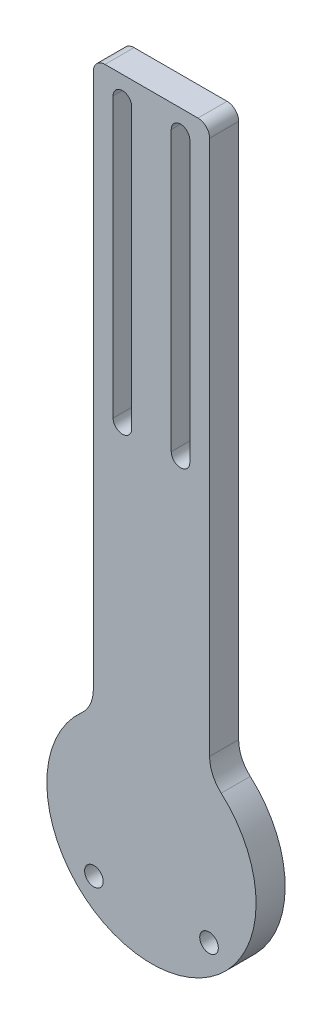
ISO-10303-21;
HEADER;
FILE_DESCRIPTION(('STEP AP214'),'2;1');
FILE_NAME('part.step','',(''),(''),'','','');
FILE_SCHEMA(('AUTOMOTIVE_DESIGN { 1 0 10303 214 1 1 1 1 }'));
ENDSEC;
DATA;
#1=APPLICATION_CONTEXT('core data for automotive mechanical design processes');
#2=APPLICATION_PROTOCOL_DEFINITION('international standard','automotive_design',2000,#1);
#3=PRODUCT_CONTEXT('',#1,'mechanical');
#4=PRODUCT('Part','Part','',(#3));
#5=PRODUCT_RELATED_PRODUCT_CATEGORY('part','',(#4));
#6=PRODUCT_DEFINITION_FORMATION('','',#4);
#7=PRODUCT_DEFINITION_CONTEXT('part definition',#1,'design');
#8=PRODUCT_DEFINITION('design','',#6,#7);
#9=PRODUCT_DEFINITION_SHAPE('','',#8);
#10=(LENGTH_UNIT() NAMED_UNIT(*) SI_UNIT(.MILLI.,.METRE.));
#11=(NAMED_UNIT(*) PLANE_ANGLE_UNIT() SI_UNIT($,.RADIAN.));
#12=(NAMED_UNIT(*) SI_UNIT($,.STERADIAN.) SOLID_ANGLE_UNIT());
#13=UNCERTAINTY_MEASURE_WITH_UNIT(LENGTH_MEASURE(1.E-05),#10,'distance_accuracy_value','');
#14=(GEOMETRIC_REPRESENTATION_CONTEXT(3) GLOBAL_UNCERTAINTY_ASSIGNED_CONTEXT((#13)) GLOBAL_UNIT_ASSIGNED_CONTEXT((#10,
#11,#12)) REPRESENTATION_CONTEXT('',''));
#15=CARTESIAN_POINT('',(0.,0.,0.));
#16=DIRECTION('',(0.,0.,1.));
#17=DIRECTION('',(1.,0.,0.));
#18=AXIS2_PLACEMENT_3D('',#15,#16,#17);
#19=CARTESIAN_POINT('',(16.,17.8885438199984,5.));
#20=DIRECTION('',(0.,0.,1.));
#21=DIRECTION('',(1.,0.,0.));
#22=AXIS2_PLACEMENT_3D('',#19,#20,#21);
#23=PLANE('',#22);
#24=CARTESIAN_POINT('',(-9.8994949366116,-9.89949493661173,5.));
#25=DIRECTION('',(0.,0.,1.));
#26=DIRECTION('',(1.,0.,0.));
#27=AXIS2_PLACEMENT_3D('',#24,#25,#26);
#28=CIRCLE('',#27,1.59999999999999);
#29=CARTESIAN_POINT('',(-8.29949493661161,-9.89949493661173,5.));
#30=VERTEX_POINT('',#29);
#31=EDGE_CURVE('E221',#30,#30,#28,.T.);
#32=ORIENTED_EDGE('',*,*,#31,.F.);
#33=EDGE_LOOP('',(#32));
#34=FACE_BOUND('',#33,.T.);
#35=CARTESIAN_POINT('',(16.,17.8885438199984,5.));
#36=DIRECTION('',(0.,0.,-1.));
#37=DIRECTION('',(1.,0.,0.));
#38=AXIS2_PLACEMENT_3D('',#35,#36,#37);
#39=CIRCLE('',#38,6.);
#40=CARTESIAN_POINT('',(12.,13.4164078649987,5.));
#41=VERTEX_POINT('',#40);
#42=CARTESIAN_POINT('',(10.,17.8885438199984,5.));
#43=VERTEX_POINT('',#42);
#44=EDGE_CURVE('E227',#41,#43,#39,.T.);
#45=ORIENTED_EDGE('',*,*,#44,.T.);
#46=DIRECTION('',(0.,1.,0.));
#47=VECTOR('',#46,1.);
#48=CARTESIAN_POINT('',(9.99999999999997,110.,5.));
#49=LINE('',#48,#47);
#50=CARTESIAN_POINT('',(9.99999999999997,110.,5.));
#51=VERTEX_POINT('',#50);
#52=EDGE_CURVE('E230',#43,#51,#49,.T.);
#53=ORIENTED_EDGE('',*,*,#52,.T.);
#54=CARTESIAN_POINT('',(7.99999999999997,110.,5.));
#55=DIRECTION('',(0.,0.,1.));
#56=DIRECTION('',(1.,0.,0.));
#57=AXIS2_PLACEMENT_3D('',#54,#55,#56);
#58=CIRCLE('',#57,2.);
#59=CARTESIAN_POINT('',(7.99999999999996,112.,5.));
#60=VERTEX_POINT('',#59);
#61=EDGE_CURVE('E233',#51,#60,#58,.T.);
#62=ORIENTED_EDGE('',*,*,#61,.T.);
#63=DIRECTION('',(-1.,0.,0.));
#64=VECTOR('',#63,1.);
#65=CARTESIAN_POINT('',(-7.99999999999995,112.,5.));
#66=LINE('',#65,#64);
#67=CARTESIAN_POINT('',(-7.99999999999995,112.,5.));
#68=VERTEX_POINT('',#67);
#69=EDGE_CURVE('E235',#60,#68,#66,.T.);
#70=ORIENTED_EDGE('',*,*,#69,.T.);
#71=CARTESIAN_POINT('',(-7.99999999999997,110.,5.));
#72=DIRECTION('',(0.,0.,1.));
#73=DIRECTION('',(-1.,0.,0.));
#74=AXIS2_PLACEMENT_3D('',#71,#72,#73);
#75=CIRCLE('',#74,2.);
#76=CARTESIAN_POINT('',(-9.99999999999997,110.,5.));
#77=VERTEX_POINT('',#76);
#78=EDGE_CURVE('E237',#68,#77,#75,.T.);
#79=ORIENTED_EDGE('',*,*,#78,.T.);
#80=DIRECTION('',(0.,-1.,0.));
#81=VECTOR('',#80,1.);
#82=CARTESIAN_POINT('',(-9.99999999999997,110.,5.));
#83=LINE('',#82,#81);
#84=CARTESIAN_POINT('',(-9.99999999999996,17.8885438199984,5.));
#85=VERTEX_POINT('',#84);
#86=EDGE_CURVE('E239',#77,#85,#83,.T.);
#87=ORIENTED_EDGE('',*,*,#86,.T.);
#88=CARTESIAN_POINT('',(-16.,17.8885438199984,5.));
#89=DIRECTION('',(0.,0.,-1.));
#90=DIRECTION('',(-1.,0.,0.));
#91=AXIS2_PLACEMENT_3D('',#88,#89,#90);
#92=CIRCLE('',#91,6.);
#93=CARTESIAN_POINT('',(-12.,13.4164078649988,5.));
#94=VERTEX_POINT('',#93);
#95=EDGE_CURVE('E241',#85,#94,#92,.T.);
#96=ORIENTED_EDGE('',*,*,#95,.T.);
#97=CARTESIAN_POINT('',(0.,0.,5.));
#98=DIRECTION('',(0.,0.,1.));
#99=DIRECTION('',(1.,0.,0.));
#100=AXIS2_PLACEMENT_3D('',#97,#98,#99);
#101=CIRCLE('',#100,18.);
#102=EDGE_CURVE('E243',#94,#41,#101,.T.);
#103=ORIENTED_EDGE('',*,*,#102,.T.);
#104=EDGE_LOOP('',(#45,#53,#62,#70,#79,#87,#96,#103));
#105=FACE_BOUND('',#104,.T.);
#106=CARTESIAN_POINT('',(9.89949493661161,-9.89949493661172,5.));
#107=DIRECTION('',(0.,0.,1.));
#108=DIRECTION('',(-1.,0.,0.));
#109=AXIS2_PLACEMENT_3D('',#106,#107,#108);
#110=CIRCLE('',#109,1.6);
#111=CARTESIAN_POINT('',(8.29949493661161,-9.89949493661172,5.));
#112=VERTEX_POINT('',#111);
#113=EDGE_CURVE('E215',#112,#112,#110,.T.);
#114=ORIENTED_EDGE('',*,*,#113,.F.);
#115=EDGE_LOOP('',(#114));
#116=FACE_BOUND('',#115,.T.);
#117=DIRECTION('',(0.,-1.,0.));
#118=VECTOR('',#117,1.);
#119=CARTESIAN_POINT('',(-6.59999999999995,108.,5.));
#120=LINE('',#119,#118);
#121=CARTESIAN_POINT('',(-6.59999999999995,108.,5.));
#122=VERTEX_POINT('',#121);
#123=CARTESIAN_POINT('',(-6.59999999999995,60.,5.));
#124=VERTEX_POINT('',#123);
#125=EDGE_CURVE('E186',#122,#124,#120,.T.);
#126=ORIENTED_EDGE('',*,*,#125,.F.);
#127=CARTESIAN_POINT('',(-4.99999999999997,108.,5.));
#128=DIRECTION('',(0.,0.,1.));
#129=DIRECTION('',(1.,0.,0.));
#130=AXIS2_PLACEMENT_3D('',#127,#128,#129);
#131=CIRCLE('',#130,1.59999999999998);
#132=CARTESIAN_POINT('',(-3.39999999999998,108.,5.));
#133=VERTEX_POINT('',#132);
#134=EDGE_CURVE('E184',#133,#122,#131,.T.);
#135=ORIENTED_EDGE('',*,*,#134,.F.);
#136=DIRECTION('',(0.,1.,0.));
#137=VECTOR('',#136,1.);
#138=CARTESIAN_POINT('',(-3.39999999999998,108.,5.));
#139=LINE('',#138,#137);
#140=CARTESIAN_POINT('',(-3.39999999999995,60.,5.));
#141=VERTEX_POINT('',#140);
#142=EDGE_CURVE('E192',#141,#133,#139,.T.);
#143=ORIENTED_EDGE('',*,*,#142,.F.);
#144=CARTESIAN_POINT('',(-4.99999999999995,60.,5.));
#145=DIRECTION('',(0.,0.,1.));
#146=DIRECTION('',(1.,0.,0.));
#147=AXIS2_PLACEMENT_3D('',#144,#145,#146);
#148=CIRCLE('',#147,1.6);
#149=EDGE_CURVE('E189',#124,#141,#148,.T.);
#150=ORIENTED_EDGE('',*,*,#149,.F.);
#151=EDGE_LOOP('',(#126,#135,#143,#150));
#152=FACE_BOUND('',#151,.T.);
#153=DIRECTION('',(0.,-1.,0.));
#154=VECTOR('',#153,1.);
#155=CARTESIAN_POINT('',(3.40000000000005,108.,5.));
#156=LINE('',#155,#154);
#157=CARTESIAN_POINT('',(3.40000000000005,108.,5.));
#158=VERTEX_POINT('',#157);
#159=CARTESIAN_POINT('',(3.40000000000003,60.,5.));
#160=VERTEX_POINT('',#159);
#161=EDGE_CURVE('E156',#158,#160,#156,.T.);
#162=ORIENTED_EDGE('',*,*,#161,.F.);
#163=CARTESIAN_POINT('',(5.00000000000003,108.,5.));
#164=DIRECTION('',(0.,0.,1.));
#165=DIRECTION('',(-1.,0.,0.));
#166=AXIS2_PLACEMENT_3D('',#163,#164,#165);
#167=CIRCLE('',#166,1.59999999999998);
#168=CARTESIAN_POINT('',(6.60000000000002,108.,5.));
#169=VERTEX_POINT('',#168);
#170=EDGE_CURVE('E148',#169,#158,#167,.T.);
#171=ORIENTED_EDGE('',*,*,#170,.F.);
#172=DIRECTION('',(0.,1.,0.));
#173=VECTOR('',#172,1.);
#174=CARTESIAN_POINT('',(6.60000000000002,108.,5.));
#175=LINE('',#174,#173);
#176=CARTESIAN_POINT('',(6.60000000000003,60.,5.));
#177=VERTEX_POINT('',#176);
#178=EDGE_CURVE('E170',#177,#169,#175,.T.);
#179=ORIENTED_EDGE('',*,*,#178,.F.);
#180=CARTESIAN_POINT('',(5.00000000000003,60.,5.));
#181=DIRECTION('',(0.,0.,1.));
#182=DIRECTION('',(-1.,0.,0.));
#183=AXIS2_PLACEMENT_3D('',#180,#181,#182);
#184=CIRCLE('',#183,1.6);
#185=EDGE_CURVE('E168',#160,#177,#184,.T.);
#186=ORIENTED_EDGE('',*,*,#185,.F.);
#187=EDGE_LOOP('',(#162,#171,#179,#186));
#188=FACE_BOUND('',#187,.T.);
#189=ADVANCED_FACE('F35',(#34,#105,#116,#152,#188),#23,.T.);
#190=CARTESIAN_POINT('',(16.,17.8885438199984,0.));
#191=DIRECTION('',(0.,0.,1.));
#192=DIRECTION('',(1.,0.,0.));
#193=AXIS2_PLACEMENT_3D('',#190,#191,#192);
#194=PLANE('',#193);
#195=CARTESIAN_POINT('',(-4.99999999999997,108.,0.));
#196=DIRECTION('',(0.,0.,1.));
#197=DIRECTION('',(1.,0.,0.));
#198=AXIS2_PLACEMENT_3D('',#195,#196,#197);
#199=CIRCLE('',#198,1.59999999999998);
#200=CARTESIAN_POINT('',(-3.39999999999998,108.,0.));
#201=VERTEX_POINT('',#200);
#202=CARTESIAN_POINT('',(-6.59999999999995,108.,0.));
#203=VERTEX_POINT('',#202);
#204=EDGE_CURVE('E164',#201,#203,#199,.T.);
#205=ORIENTED_EDGE('',*,*,#204,.T.);
#206=DIRECTION('',(0.,-1.,0.));
#207=VECTOR('',#206,1.);
#208=CARTESIAN_POINT('',(-6.59999999999995,108.,0.));
#209=LINE('',#208,#207);
#210=CARTESIAN_POINT('',(-6.59999999999995,60.,0.));
#211=VERTEX_POINT('',#210);
#212=EDGE_CURVE('E197',#203,#211,#209,.T.);
#213=ORIENTED_EDGE('',*,*,#212,.T.);
#214=CARTESIAN_POINT('',(-4.99999999999995,60.,0.));
#215=DIRECTION('',(0.,0.,1.));
#216=DIRECTION('',(1.,0.,0.));
#217=AXIS2_PLACEMENT_3D('',#214,#215,#216);
#218=CIRCLE('',#217,1.6);
#219=CARTESIAN_POINT('',(-3.39999999999996,60.,0.));
#220=VERTEX_POINT('',#219);
#221=EDGE_CURVE('E200',#211,#220,#218,.T.);
#222=ORIENTED_EDGE('',*,*,#221,.T.);
#223=DIRECTION('',(0.,1.,0.));
#224=VECTOR('',#223,1.);
#225=CARTESIAN_POINT('',(-3.39999999999998,108.,0.));
#226=LINE('',#225,#224);
#227=EDGE_CURVE('E187',#220,#201,#226,.T.);
#228=ORIENTED_EDGE('',*,*,#227,.T.);
#229=EDGE_LOOP('',(#205,#213,#222,#228));
#230=FACE_BOUND('',#229,.T.);
#231=CARTESIAN_POINT('',(16.,17.8885438199984,0.));
#232=DIRECTION('',(0.,0.,-1.));
#233=DIRECTION('',(1.,0.,0.));
#234=AXIS2_PLACEMENT_3D('',#231,#232,#233);
#235=CIRCLE('',#234,6.);
#236=CARTESIAN_POINT('',(12.,13.4164078649987,0.));
#237=VERTEX_POINT('',#236);
#238=CARTESIAN_POINT('',(10.,17.8885438199984,0.));
#239=VERTEX_POINT('',#238);
#240=EDGE_CURVE('E224',#237,#239,#235,.T.);
#241=ORIENTED_EDGE('',*,*,#240,.F.);
#242=CARTESIAN_POINT('',(0.,0.,0.));
#243=DIRECTION('',(0.,0.,1.));
#244=DIRECTION('',(1.,0.,0.));
#245=AXIS2_PLACEMENT_3D('',#242,#243,#244);
#246=CIRCLE('',#245,18.);
#247=CARTESIAN_POINT('',(-12.,13.4164078649988,0.));
#248=VERTEX_POINT('',#247);
#249=EDGE_CURVE('E231',#248,#237,#246,.T.);
#250=ORIENTED_EDGE('',*,*,#249,.F.);
#251=CARTESIAN_POINT('',(-16.,17.8885438199984,0.));
#252=DIRECTION('',(0.,0.,-1.));
#253=DIRECTION('',(-1.,0.,0.));
#254=AXIS2_PLACEMENT_3D('',#251,#252,#253);
#255=CIRCLE('',#254,6.);
#256=CARTESIAN_POINT('',(-9.99999999999996,17.8885438199984,0.));
#257=VERTEX_POINT('',#256);
#258=EDGE_CURVE('E258',#257,#248,#255,.T.);
#259=ORIENTED_EDGE('',*,*,#258,.F.);
#260=DIRECTION('',(0.,-1.,0.));
#261=VECTOR('',#260,1.);
#262=CARTESIAN_POINT('',(-9.99999999999997,110.,0.));
#263=LINE('',#262,#261);
#264=CARTESIAN_POINT('',(-9.99999999999997,110.,0.));
#265=VERTEX_POINT('',#264);
#266=EDGE_CURVE('E256',#265,#257,#263,.T.);
#267=ORIENTED_EDGE('',*,*,#266,.F.);
#268=CARTESIAN_POINT('',(-7.99999999999997,110.,0.));
#269=DIRECTION('',(0.,0.,1.));
#270=DIRECTION('',(-1.,0.,0.));
#271=AXIS2_PLACEMENT_3D('',#268,#269,#270);
#272=CIRCLE('',#271,2.);
#273=CARTESIAN_POINT('',(-7.99999999999995,112.,0.));
#274=VERTEX_POINT('',#273);
#275=EDGE_CURVE('E254',#274,#265,#272,.T.);
#276=ORIENTED_EDGE('',*,*,#275,.F.);
#277=DIRECTION('',(-1.,0.,0.));
#278=VECTOR('',#277,1.);
#279=CARTESIAN_POINT('',(-7.99999999999995,112.,0.));
#280=LINE('',#279,#278);
#281=CARTESIAN_POINT('',(7.99999999999996,112.,0.));
#282=VERTEX_POINT('',#281);
#283=EDGE_CURVE('E252',#282,#274,#280,.T.);
#284=ORIENTED_EDGE('',*,*,#283,.F.);
#285=CARTESIAN_POINT('',(7.99999999999997,110.,0.));
#286=DIRECTION('',(0.,0.,1.));
#287=DIRECTION('',(1.,0.,0.));
#288=AXIS2_PLACEMENT_3D('',#285,#286,#287);
#289=CIRCLE('',#288,2.);
#290=CARTESIAN_POINT('',(9.99999999999997,110.,0.));
#291=VERTEX_POINT('',#290);
#292=EDGE_CURVE('E250',#291,#282,#289,.T.);
#293=ORIENTED_EDGE('',*,*,#292,.F.);
#294=DIRECTION('',(0.,1.,0.));
#295=VECTOR('',#294,1.);
#296=CARTESIAN_POINT('',(9.99999999999997,110.,0.));
#297=LINE('',#296,#295);
#298=EDGE_CURVE('E248',#239,#291,#297,.T.);
#299=ORIENTED_EDGE('',*,*,#298,.F.);
#300=EDGE_LOOP('',(#241,#250,#259,#267,#276,#284,#293,#299));
#301=FACE_BOUND('',#300,.T.);
#302=CARTESIAN_POINT('',(-9.8994949366116,-9.89949493661173,0.));
#303=DIRECTION('',(0.,0.,1.));
#304=DIRECTION('',(1.,0.,0.));
#305=AXIS2_PLACEMENT_3D('',#302,#303,#304);
#306=CIRCLE('',#305,1.59999999999999);
#307=CARTESIAN_POINT('',(-8.29949493661161,-9.89949493661173,0.));
#308=VERTEX_POINT('',#307);
#309=EDGE_CURVE('E218',#308,#308,#306,.T.);
#310=ORIENTED_EDGE('',*,*,#309,.T.);
#311=EDGE_LOOP('',(#310));
#312=FACE_BOUND('',#311,.T.);
#313=CARTESIAN_POINT('',(9.89949493661161,-9.89949493661172,0.));
#314=DIRECTION('',(0.,0.,1.));
#315=DIRECTION('',(-1.,0.,0.));
#316=AXIS2_PLACEMENT_3D('',#313,#314,#315);
#317=CIRCLE('',#316,1.6);
#318=CARTESIAN_POINT('',(8.29949493661161,-9.89949493661172,0.));
#319=VERTEX_POINT('',#318);
#320=EDGE_CURVE('E214',#319,#319,#317,.T.);
#321=ORIENTED_EDGE('',*,*,#320,.T.);
#322=EDGE_LOOP('',(#321));
#323=FACE_BOUND('',#322,.T.);
#324=CARTESIAN_POINT('',(5.00000000000003,108.,0.));
#325=DIRECTION('',(0.,0.,1.));
#326=DIRECTION('',(-1.,0.,0.));
#327=AXIS2_PLACEMENT_3D('',#324,#325,#326);
#328=CIRCLE('',#327,1.59999999999998);
#329=CARTESIAN_POINT('',(6.60000000000002,108.,0.));
#330=VERTEX_POINT('',#329);
#331=CARTESIAN_POINT('',(3.40000000000005,108.,0.));
#332=VERTEX_POINT('',#331);
#333=EDGE_CURVE('E58',#330,#332,#328,.T.);
#334=ORIENTED_EDGE('',*,*,#333,.T.);
#335=DIRECTION('',(0.,-1.,0.));
#336=VECTOR('',#335,1.);
#337=CARTESIAN_POINT('',(3.40000000000005,108.,0.));
#338=LINE('',#337,#336);
#339=CARTESIAN_POINT('',(3.40000000000003,60.,0.));
#340=VERTEX_POINT('',#339);
#341=EDGE_CURVE('E163',#332,#340,#338,.T.);
#342=ORIENTED_EDGE('',*,*,#341,.T.);
#343=CARTESIAN_POINT('',(5.00000000000003,60.,0.));
#344=DIRECTION('',(0.,0.,1.));
#345=DIRECTION('',(-1.,0.,0.));
#346=AXIS2_PLACEMENT_3D('',#343,#344,#345);
#347=CIRCLE('',#346,1.6);
#348=CARTESIAN_POINT('',(6.60000000000003,60.,0.));
#349=VERTEX_POINT('',#348);
#350=EDGE_CURVE('E176',#340,#349,#347,.T.);
#351=ORIENTED_EDGE('',*,*,#350,.T.);
#352=DIRECTION('',(0.,1.,0.));
#353=VECTOR('',#352,1.);
#354=CARTESIAN_POINT('',(6.60000000000002,108.,0.));
#355=LINE('',#354,#353);
#356=EDGE_CURVE('E157',#349,#330,#355,.T.);
#357=ORIENTED_EDGE('',*,*,#356,.T.);
#358=EDGE_LOOP('',(#334,#342,#351,#357));
#359=FACE_BOUND('',#358,.T.);
#360=ADVANCED_FACE('F288',(#230,#301,#312,#323,#359),#194,.F.);
#361=CARTESIAN_POINT('',(16.,17.8885438199984,5.));
#362=DIRECTION('',(0.,0.,-1.));
#363=DIRECTION('',(-1.,0.,0.));
#364=AXIS2_PLACEMENT_3D('',#361,#362,#363);
#365=CYLINDRICAL_SURFACE('',#364,6.);
#366=ORIENTED_EDGE('',*,*,#240,.T.);
#367=DIRECTION('',(0.,0.,-1.));
#368=VECTOR('',#367,1.);
#369=CARTESIAN_POINT('',(10.,17.8885438199984,5.));
#370=LINE('',#369,#368);
#371=EDGE_CURVE('E11',#43,#239,#370,.T.);
#372=ORIENTED_EDGE('',*,*,#371,.F.);
#373=ORIENTED_EDGE('',*,*,#44,.F.);
#374=DIRECTION('',(0.,0.,-1.));
#375=VECTOR('',#374,1.);
#376=CARTESIAN_POINT('',(12.,13.4164078649987,5.));
#377=LINE('',#376,#375);
#378=EDGE_CURVE('E245',#41,#237,#377,.T.);
#379=ORIENTED_EDGE('',*,*,#378,.T.);
#380=EDGE_LOOP('',(#366,#372,#373,#379));
#381=FACE_BOUND('',#380,.T.);
#382=ADVANCED_FACE('F37',(#381),#365,.F.);
#383=CARTESIAN_POINT('',(9.99999999999997,110.,5.));
#384=DIRECTION('',(-1.,0.,0.));
#385=DIRECTION('',(0.,-1.,0.));
#386=AXIS2_PLACEMENT_3D('',#383,#384,#385);
#387=PLANE('',#386);
#388=ORIENTED_EDGE('',*,*,#298,.T.);
#389=DIRECTION('',(0.,0.,-1.));
#390=VECTOR('',#389,1.);
#391=CARTESIAN_POINT('',(9.99999999999997,110.,5.));
#392=LINE('',#391,#390);
#393=EDGE_CURVE('E43',#51,#291,#392,.T.);
#394=ORIENTED_EDGE('',*,*,#393,.F.);
#395=ORIENTED_EDGE('',*,*,#52,.F.);
#396=ORIENTED_EDGE('',*,*,#371,.T.);
#397=EDGE_LOOP('',(#388,#394,#395,#396));
#398=FACE_BOUND('',#397,.T.);
#399=ADVANCED_FACE('F306',(#398),#387,.F.);
#400=CARTESIAN_POINT('',(7.99999999999997,110.,5.));
#401=DIRECTION('',(0.,0.,-1.));
#402=DIRECTION('',(-1.,0.,0.));
#403=AXIS2_PLACEMENT_3D('',#400,#401,#402);
#404=CYLINDRICAL_SURFACE('',#403,2.);
#405=ORIENTED_EDGE('',*,*,#292,.T.);
#406=DIRECTION('',(0.,0.,-1.));
#407=VECTOR('',#406,1.);
#408=CARTESIAN_POINT('',(7.99999999999996,112.,5.));
#409=LINE('',#408,#407);
#410=EDGE_CURVE('E275',#60,#282,#409,.T.);
#411=ORIENTED_EDGE('',*,*,#410,.F.);
#412=ORIENTED_EDGE('',*,*,#61,.F.);
#413=ORIENTED_EDGE('',*,*,#393,.T.);
#414=EDGE_LOOP('',(#405,#411,#412,#413));
#415=FACE_BOUND('',#414,.T.);
#416=ADVANCED_FACE('F282',(#415),#404,.T.);
#417=CARTESIAN_POINT('',(-7.99999999999995,112.,5.));
#418=DIRECTION('',(0.,-1.,0.));
#419=DIRECTION('',(0.,0.,-1.));
#420=AXIS2_PLACEMENT_3D('',#417,#418,#419);
#421=PLANE('',#420);
#422=ORIENTED_EDGE('',*,*,#283,.T.);
#423=DIRECTION('',(0.,0.,-1.));
#424=VECTOR('',#423,1.);
#425=CARTESIAN_POINT('',(-7.99999999999995,112.,5.));
#426=LINE('',#425,#424);
#427=EDGE_CURVE('E272',#68,#274,#426,.T.);
#428=ORIENTED_EDGE('',*,*,#427,.F.);
#429=ORIENTED_EDGE('',*,*,#69,.F.);
#430=ORIENTED_EDGE('',*,*,#410,.T.);
#431=EDGE_LOOP('',(#422,#428,#429,#430));
#432=FACE_BOUND('',#431,.T.);
#433=ADVANCED_FACE('F294',(#432),#421,.F.);
#434=CARTESIAN_POINT('',(-7.99999999999997,110.,5.));
#435=DIRECTION('',(0.,0.,-1.));
#436=DIRECTION('',(-1.,0.,0.));
#437=AXIS2_PLACEMENT_3D('',#434,#435,#436);
#438=CYLINDRICAL_SURFACE('',#437,2.);
#439=ORIENTED_EDGE('',*,*,#275,.T.);
#440=DIRECTION('',(0.,0.,-1.));
#441=VECTOR('',#440,1.);
#442=CARTESIAN_POINT('',(-9.99999999999997,110.,5.));
#443=LINE('',#442,#441);
#444=EDGE_CURVE('E269',#77,#265,#443,.T.);
#445=ORIENTED_EDGE('',*,*,#444,.F.);
#446=ORIENTED_EDGE('',*,*,#78,.F.);
#447=ORIENTED_EDGE('',*,*,#427,.T.);
#448=EDGE_LOOP('',(#439,#445,#446,#447));
#449=FACE_BOUND('',#448,.T.);
#450=ADVANCED_FACE('F298',(#449),#438,.T.);
#451=CARTESIAN_POINT('',(-9.99999999999997,110.,5.));
#452=DIRECTION('',(1.,0.,0.));
#453=DIRECTION('',(0.,1.,0.));
#454=AXIS2_PLACEMENT_3D('',#451,#452,#453);
#455=PLANE('',#454);
#456=ORIENTED_EDGE('',*,*,#266,.T.);
#457=DIRECTION('',(0.,0.,-1.));
#458=VECTOR('',#457,1.);
#459=CARTESIAN_POINT('',(-9.99999999999996,17.8885438199984,5.));
#460=LINE('',#459,#458);
#461=EDGE_CURVE('E266',#85,#257,#460,.T.);
#462=ORIENTED_EDGE('',*,*,#461,.F.);
#463=ORIENTED_EDGE('',*,*,#86,.F.);
#464=ORIENTED_EDGE('',*,*,#444,.T.);
#465=EDGE_LOOP('',(#456,#462,#463,#464));
#466=FACE_BOUND('',#465,.T.);
#467=ADVANCED_FACE('F319',(#466),#455,.F.);
#468=CARTESIAN_POINT('',(-16.,17.8885438199984,5.));
#469=DIRECTION('',(0.,0.,-1.));
#470=DIRECTION('',(-1.,0.,0.));
#471=AXIS2_PLACEMENT_3D('',#468,#469,#470);
#472=CYLINDRICAL_SURFACE('',#471,6.);
#473=ORIENTED_EDGE('',*,*,#258,.T.);
#474=DIRECTION('',(0.,0.,-1.));
#475=VECTOR('',#474,1.);
#476=CARTESIAN_POINT('',(-12.,13.4164078649988,5.));
#477=LINE('',#476,#475);
#478=EDGE_CURVE('E263',#94,#248,#477,.T.);
#479=ORIENTED_EDGE('',*,*,#478,.F.);
#480=ORIENTED_EDGE('',*,*,#95,.F.);
#481=ORIENTED_EDGE('',*,*,#461,.T.);
#482=EDGE_LOOP('',(#473,#479,#480,#481));
#483=FACE_BOUND('',#482,.T.);
#484=ADVANCED_FACE('F317',(#483),#472,.F.);
#485=CARTESIAN_POINT('',(0.,0.,5.));
#486=DIRECTION('',(0.,0.,-1.));
#487=DIRECTION('',(-1.,0.,0.));
#488=AXIS2_PLACEMENT_3D('',#485,#486,#487);
#489=CYLINDRICAL_SURFACE('',#488,18.);
#490=ORIENTED_EDGE('',*,*,#249,.T.);
#491=ORIENTED_EDGE('',*,*,#378,.F.);
#492=ORIENTED_EDGE('',*,*,#102,.F.);
#493=ORIENTED_EDGE('',*,*,#478,.T.);
#494=EDGE_LOOP('',(#490,#491,#492,#493));
#495=FACE_BOUND('',#494,.T.);
#496=ADVANCED_FACE('F312',(#495),#489,.T.);
#497=CARTESIAN_POINT('',(-9.8994949366116,-9.89949493661173,5.));
#498=DIRECTION('',(0.,0.,-1.));
#499=DIRECTION('',(-1.,0.,0.));
#500=AXIS2_PLACEMENT_3D('',#497,#498,#499);
#501=CYLINDRICAL_SURFACE('',#500,1.59999999999999);
#502=ORIENTED_EDGE('',*,*,#31,.T.);
#503=EDGE_LOOP('',(#502));
#504=FACE_BOUND('',#503,.T.);
#505=ORIENTED_EDGE('',*,*,#309,.F.);
#506=EDGE_LOOP('',(#505));
#507=FACE_BOUND('',#506,.T.);
#508=ADVANCED_FACE('F338',(#504,#507),#501,.F.);
#509=CARTESIAN_POINT('',(9.89949493661161,-9.89949493661172,5.));
#510=DIRECTION('',(0.,0.,-1.));
#511=DIRECTION('',(-1.,0.,0.));
#512=AXIS2_PLACEMENT_3D('',#509,#510,#511);
#513=CYLINDRICAL_SURFACE('',#512,1.6);
#514=ORIENTED_EDGE('',*,*,#113,.T.);
#515=EDGE_LOOP('',(#514));
#516=FACE_BOUND('',#515,.T.);
#517=ORIENTED_EDGE('',*,*,#320,.F.);
#518=EDGE_LOOP('',(#517));
#519=FACE_BOUND('',#518,.T.);
#520=ADVANCED_FACE('F345',(#516,#519),#513,.F.);
#521=CARTESIAN_POINT('',(-4.99999999999997,108.,5.));
#522=DIRECTION('',(0.,0.,-1.));
#523=DIRECTION('',(-1.,0.,0.));
#524=AXIS2_PLACEMENT_3D('',#521,#522,#523);
#525=CYLINDRICAL_SURFACE('',#524,1.59999999999998);
#526=ORIENTED_EDGE('',*,*,#204,.F.);
#527=DIRECTION('',(0.,0.,-1.));
#528=VECTOR('',#527,1.);
#529=CARTESIAN_POINT('',(-3.39999999999998,108.,5.));
#530=LINE('',#529,#528);
#531=EDGE_CURVE('E194',#133,#201,#530,.T.);
#532=ORIENTED_EDGE('',*,*,#531,.F.);
#533=ORIENTED_EDGE('',*,*,#134,.T.);
#534=DIRECTION('',(0.,0.,-1.));
#535=VECTOR('',#534,1.);
#536=CARTESIAN_POINT('',(-6.59999999999995,108.,5.));
#537=LINE('',#536,#535);
#538=EDGE_CURVE('E211',#122,#203,#537,.T.);
#539=ORIENTED_EDGE('',*,*,#538,.T.);
#540=EDGE_LOOP('',(#526,#532,#533,#539));
#541=FACE_BOUND('',#540,.T.);
#542=ADVANCED_FACE('F350',(#541),#525,.F.);
#543=CARTESIAN_POINT('',(-6.59999999999995,108.,5.));
#544=DIRECTION('',(1.,0.,0.));
#545=DIRECTION('',(0.,1.,0.));
#546=AXIS2_PLACEMENT_3D('',#543,#544,#545);
#547=PLANE('',#546);
#548=ORIENTED_EDGE('',*,*,#212,.F.);
#549=ORIENTED_EDGE('',*,*,#538,.F.);
#550=ORIENTED_EDGE('',*,*,#125,.T.);
#551=DIRECTION('',(0.,0.,-1.));
#552=VECTOR('',#551,1.);
#553=CARTESIAN_POINT('',(-6.59999999999995,60.,5.));
#554=LINE('',#553,#552);
#555=EDGE_CURVE('E209',#124,#211,#554,.T.);
#556=ORIENTED_EDGE('',*,*,#555,.T.);
#557=EDGE_LOOP('',(#548,#549,#550,#556));
#558=FACE_BOUND('',#557,.T.);
#559=ADVANCED_FACE('F379',(#558),#547,.T.);
#560=CARTESIAN_POINT('',(-4.99999999999995,60.,5.));
#561=DIRECTION('',(0.,0.,-1.));
#562=DIRECTION('',(-1.,0.,0.));
#563=AXIS2_PLACEMENT_3D('',#560,#561,#562);
#564=CYLINDRICAL_SURFACE('',#563,1.6);
#565=ORIENTED_EDGE('',*,*,#221,.F.);
#566=ORIENTED_EDGE('',*,*,#555,.F.);
#567=ORIENTED_EDGE('',*,*,#149,.T.);
#568=DIRECTION('',(0.,0.,-1.));
#569=VECTOR('',#568,1.);
#570=CARTESIAN_POINT('',(-3.39999999999996,60.,5.));
#571=LINE('',#570,#569);
#572=EDGE_CURVE('E207',#141,#220,#571,.T.);
#573=ORIENTED_EDGE('',*,*,#572,.T.);
#574=EDGE_LOOP('',(#565,#566,#567,#573));
#575=FACE_BOUND('',#574,.T.);
#576=ADVANCED_FACE('F375',(#575),#564,.F.);
#577=CARTESIAN_POINT('',(-3.39999999999998,108.,5.));
#578=DIRECTION('',(-1.,0.,0.));
#579=DIRECTION('',(0.,-1.,0.));
#580=AXIS2_PLACEMENT_3D('',#577,#578,#579);
#581=PLANE('',#580);
#582=ORIENTED_EDGE('',*,*,#227,.F.);
#583=ORIENTED_EDGE('',*,*,#572,.F.);
#584=ORIENTED_EDGE('',*,*,#142,.T.);
#585=ORIENTED_EDGE('',*,*,#531,.T.);
#586=EDGE_LOOP('',(#582,#583,#584,#585));
#587=FACE_BOUND('',#586,.T.);
#588=ADVANCED_FACE('F372',(#587),#581,.T.);
#589=CARTESIAN_POINT('',(5.00000000000003,108.,5.));
#590=DIRECTION('',(0.,0.,-1.));
#591=DIRECTION('',(-1.,0.,0.));
#592=AXIS2_PLACEMENT_3D('',#589,#590,#591);
#593=CYLINDRICAL_SURFACE('',#592,1.59999999999998);
#594=ORIENTED_EDGE('',*,*,#333,.F.);
#595=DIRECTION('',(0.,0.,-1.));
#596=VECTOR('',#595,1.);
#597=CARTESIAN_POINT('',(6.60000000000002,108.,5.));
#598=LINE('',#597,#596);
#599=EDGE_CURVE('E152',#169,#330,#598,.T.);
#600=ORIENTED_EDGE('',*,*,#599,.F.);
#601=ORIENTED_EDGE('',*,*,#170,.T.);
#602=DIRECTION('',(0.,0.,-1.));
#603=VECTOR('',#602,1.);
#604=CARTESIAN_POINT('',(3.40000000000005,108.,5.));
#605=LINE('',#604,#603);
#606=EDGE_CURVE('E151',#158,#332,#605,.T.);
#607=ORIENTED_EDGE('',*,*,#606,.T.);
#608=EDGE_LOOP('',(#594,#600,#601,#607));
#609=FACE_BOUND('',#608,.T.);
#610=ADVANCED_FACE('F150',(#609),#593,.F.);
#611=CARTESIAN_POINT('',(3.40000000000005,108.,5.));
#612=DIRECTION('',(1.,0.,0.));
#613=DIRECTION('',(0.,1.,0.));
#614=AXIS2_PLACEMENT_3D('',#611,#612,#613);
#615=PLANE('',#614);
#616=ORIENTED_EDGE('',*,*,#341,.F.);
#617=ORIENTED_EDGE('',*,*,#606,.F.);
#618=ORIENTED_EDGE('',*,*,#161,.T.);
#619=DIRECTION('',(0.,0.,-1.));
#620=VECTOR('',#619,1.);
#621=CARTESIAN_POINT('',(3.40000000000003,60.,5.));
#622=LINE('',#621,#620);
#623=EDGE_CURVE('E165',#160,#340,#622,.T.);
#624=ORIENTED_EDGE('',*,*,#623,.T.);
#625=EDGE_LOOP('',(#616,#617,#618,#624));
#626=FACE_BOUND('',#625,.T.);
#627=ADVANCED_FACE('F160',(#626),#615,.T.);
#628=CARTESIAN_POINT('',(5.00000000000003,60.,5.));
#629=DIRECTION('',(0.,0.,-1.));
#630=DIRECTION('',(-1.,0.,0.));
#631=AXIS2_PLACEMENT_3D('',#628,#629,#630);
#632=CYLINDRICAL_SURFACE('',#631,1.6);
#633=ORIENTED_EDGE('',*,*,#350,.F.);
#634=ORIENTED_EDGE('',*,*,#623,.F.);
#635=ORIENTED_EDGE('',*,*,#185,.T.);
#636=DIRECTION('',(0.,0.,-1.));
#637=VECTOR('',#636,1.);
#638=CARTESIAN_POINT('',(6.60000000000003,60.,5.));
#639=LINE('',#638,#637);
#640=EDGE_CURVE('E50',#177,#349,#639,.T.);
#641=ORIENTED_EDGE('',*,*,#640,.T.);
#642=EDGE_LOOP('',(#633,#634,#635,#641));
#643=FACE_BOUND('',#642,.T.);
#644=ADVANCED_FACE('F360',(#643),#632,.F.);
#645=CARTESIAN_POINT('',(6.60000000000002,108.,5.));
#646=DIRECTION('',(-1.,0.,0.));
#647=DIRECTION('',(0.,-1.,0.));
#648=AXIS2_PLACEMENT_3D('',#645,#646,#647);
#649=PLANE('',#648);
#650=ORIENTED_EDGE('',*,*,#356,.F.);
#651=ORIENTED_EDGE('',*,*,#640,.F.);
#652=ORIENTED_EDGE('',*,*,#178,.T.);
#653=ORIENTED_EDGE('',*,*,#599,.T.);
#654=EDGE_LOOP('',(#650,#651,#652,#653));
#655=FACE_BOUND('',#654,.T.);
#656=ADVANCED_FACE('F358',(#655),#649,.T.);
#657=CLOSED_SHELL('',(#189,#360,#382,#399,#416,#433,#450,#467,#484,#496,#508,#520,#542,#559,
#576,#588,#610,#627,#644,#656));
#658=MANIFOLD_SOLID_BREP('B2',#657);
#659=ADVANCED_BREP_SHAPE_REPRESENTATION('',(#18,#658),#14);
#660=SHAPE_DEFINITION_REPRESENTATION(#9,#659);
ENDSEC;
END-ISO-10303-21;
